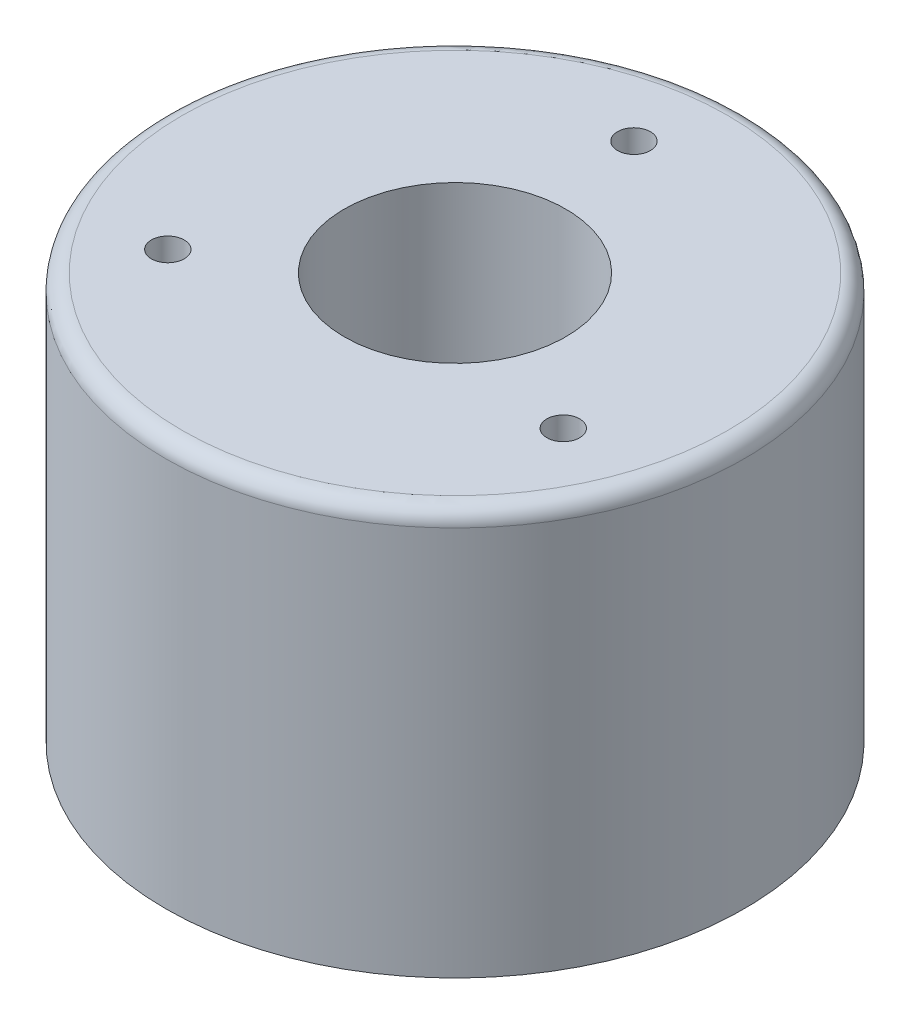
ISO-10303-21;
HEADER;
FILE_DESCRIPTION(('STEP AP214'),'2;1');
FILE_NAME('part.step','',(''),(''),'','','');
FILE_SCHEMA(('AUTOMOTIVE_DESIGN { 1 0 10303 214 1 1 1 1 }'));
ENDSEC;
DATA;
#1=APPLICATION_CONTEXT('core data for automotive mechanical design processes');
#2=APPLICATION_PROTOCOL_DEFINITION('international standard','automotive_design',2000,#1);
#3=PRODUCT_CONTEXT('',#1,'mechanical');
#4=PRODUCT('Part','Part','',(#3));
#5=PRODUCT_RELATED_PRODUCT_CATEGORY('part','',(#4));
#6=PRODUCT_DEFINITION_FORMATION('','',#4);
#7=PRODUCT_DEFINITION_CONTEXT('part definition',#1,'design');
#8=PRODUCT_DEFINITION('design','',#6,#7);
#9=PRODUCT_DEFINITION_SHAPE('','',#8);
#10=(LENGTH_UNIT() NAMED_UNIT(*) SI_UNIT(.MILLI.,.METRE.));
#11=(NAMED_UNIT(*) PLANE_ANGLE_UNIT() SI_UNIT($,.RADIAN.));
#12=(NAMED_UNIT(*) SI_UNIT($,.STERADIAN.) SOLID_ANGLE_UNIT());
#13=UNCERTAINTY_MEASURE_WITH_UNIT(LENGTH_MEASURE(1.E-05),#10,'distance_accuracy_value','');
#14=(GEOMETRIC_REPRESENTATION_CONTEXT(3) GLOBAL_UNCERTAINTY_ASSIGNED_CONTEXT((#13)) GLOBAL_UNIT_ASSIGNED_CONTEXT((#10,
#11,#12)) REPRESENTATION_CONTEXT('',''));
#15=CARTESIAN_POINT('',(0.,0.,0.));
#16=DIRECTION('',(0.,0.,1.));
#17=DIRECTION('',(1.,0.,0.));
#18=AXIS2_PLACEMENT_3D('',#15,#16,#17);
#19=CARTESIAN_POINT('',(0.,50.292,0.));
#20=DIRECTION('',(0.,1.,0.));
#21=DIRECTION('',(0.,0.,1.));
#22=AXIS2_PLACEMENT_3D('',#19,#20,#21);
#23=PLANE('',#22);
#24=CARTESIAN_POINT('',(0.,50.292,0.));
#25=DIRECTION('',(0.,1.,0.));
#26=DIRECTION('',(0.,0.,1.));
#27=AXIS2_PLACEMENT_3D('',#24,#25,#26);
#28=CIRCLE('',#27,33.782);
#29=CARTESIAN_POINT('',(0.,50.292,33.782));
#30=VERTEX_POINT('',#29);
#31=EDGE_CURVE('E40',#30,#30,#28,.T.);
#32=ORIENTED_EDGE('',*,*,#31,.T.);
#33=EDGE_LOOP('',(#32));
#34=FACE_BOUND('',#33,.T.);
#35=CARTESIAN_POINT('',(0.,50.292,0.));
#36=DIRECTION('',(0.,1.,0.));
#37=DIRECTION('',(0.,0.,1.));
#38=AXIS2_PLACEMENT_3D('',#35,#36,#37);
#39=CIRCLE('',#38,13.716);
#40=CARTESIAN_POINT('',(0.,50.292,13.716));
#41=VERTEX_POINT('',#40);
#42=EDGE_CURVE('E69',#41,#41,#39,.T.);
#43=ORIENTED_EDGE('',*,*,#42,.F.);
#44=EDGE_LOOP('',(#43));
#45=FACE_BOUND('',#44,.T.);
#46=CARTESIAN_POINT('',(-3.0577790640726,50.292,-25.2152728955155));
#47=DIRECTION('',(0.,1.,0.));
#48=DIRECTION('',(0.,0.,1.));
#49=AXIS2_PLACEMENT_3D('',#46,#47,#48);
#50=CIRCLE('',#49,2.032);
#51=CARTESIAN_POINT('',(-3.0577790640726,50.292,-23.1832728955155));
#52=VERTEX_POINT('',#51);
#53=EDGE_CURVE('E54',#52,#52,#50,.T.);
#54=ORIENTED_EDGE('',*,*,#53,.F.);
#55=EDGE_LOOP('',(#54));
#56=FACE_BOUND('',#55,.T.);
#57=CARTESIAN_POINT('',(-20.3081773588373,50.292,15.2557507964049));
#58=DIRECTION('',(0.,1.,0.));
#59=DIRECTION('',(0.,0.,1.));
#60=AXIS2_PLACEMENT_3D('',#57,#58,#59);
#61=CIRCLE('',#60,2.032);
#62=CARTESIAN_POINT('',(-20.3081773588373,50.292,17.2877507964049));
#63=VERTEX_POINT('',#62);
#64=EDGE_CURVE('E48',#63,#63,#61,.T.);
#65=ORIENTED_EDGE('',*,*,#64,.F.);
#66=EDGE_LOOP('',(#65));
#67=FACE_BOUND('',#66,.T.);
#68=CARTESIAN_POINT('',(23.3659564229099,50.292,9.95952209911079));
#69=DIRECTION('',(0.,1.,0.));
#70=DIRECTION('',(0.,0.,1.));
#71=AXIS2_PLACEMENT_3D('',#68,#69,#70);
#72=CIRCLE('',#71,2.032);
#73=CARTESIAN_POINT('',(23.3659564229099,50.292,11.9915220991108));
#74=VERTEX_POINT('',#73);
#75=EDGE_CURVE('E60',#74,#74,#72,.T.);
#76=ORIENTED_EDGE('',*,*,#75,.F.);
#77=EDGE_LOOP('',(#76));
#78=FACE_BOUND('',#77,.T.);
#79=ADVANCED_FACE('F33',(#34,#45,#56,#67,#78),#23,.T.);
#80=CARTESIAN_POINT('',(0.,0.,0.));
#81=DIRECTION('',(0.,1.,0.));
#82=DIRECTION('',(0.,0.,1.));
#83=AXIS2_PLACEMENT_3D('',#80,#81,#82);
#84=PLANE('',#83);
#85=CARTESIAN_POINT('',(0.,0.,0.));
#86=DIRECTION('',(0.,1.,0.));
#87=DIRECTION('',(0.,0.,1.));
#88=AXIS2_PLACEMENT_3D('',#85,#86,#87);
#89=CIRCLE('',#88,35.814);
#90=CARTESIAN_POINT('',(0.,0.,35.814));
#91=VERTEX_POINT('',#90);
#92=EDGE_CURVE('E44',#91,#91,#89,.T.);
#93=ORIENTED_EDGE('',*,*,#92,.F.);
#94=EDGE_LOOP('',(#93));
#95=FACE_BOUND('',#94,.T.);
#96=CARTESIAN_POINT('',(-20.3081773588373,0.,15.2557507964049));
#97=DIRECTION('',(0.,1.,0.));
#98=DIRECTION('',(0.,0.,1.));
#99=AXIS2_PLACEMENT_3D('',#96,#97,#98);
#100=CIRCLE('',#99,2.032);
#101=CARTESIAN_POINT('',(-20.3081773588373,0.,17.2877507964049));
#102=VERTEX_POINT('',#101);
#103=EDGE_CURVE('E51',#102,#102,#100,.T.);
#104=ORIENTED_EDGE('',*,*,#103,.T.);
#105=EDGE_LOOP('',(#104));
#106=FACE_BOUND('',#105,.T.);
#107=CARTESIAN_POINT('',(-3.0577790640726,0.,-25.2152728955155));
#108=DIRECTION('',(0.,1.,0.));
#109=DIRECTION('',(0.,0.,1.));
#110=AXIS2_PLACEMENT_3D('',#107,#108,#109);
#111=CIRCLE('',#110,2.032);
#112=CARTESIAN_POINT('',(-3.0577790640726,0.,-23.1832728955155));
#113=VERTEX_POINT('',#112);
#114=EDGE_CURVE('E57',#113,#113,#111,.T.);
#115=ORIENTED_EDGE('',*,*,#114,.T.);
#116=EDGE_LOOP('',(#115));
#117=FACE_BOUND('',#116,.T.);
#118=CARTESIAN_POINT('',(23.3659564229099,0.,9.95952209911079));
#119=DIRECTION('',(0.,1.,0.));
#120=DIRECTION('',(0.,0.,1.));
#121=AXIS2_PLACEMENT_3D('',#118,#119,#120);
#122=CIRCLE('',#121,2.032);
#123=CARTESIAN_POINT('',(23.3659564229099,0.,11.9915220991108));
#124=VERTEX_POINT('',#123);
#125=EDGE_CURVE('E63',#124,#124,#122,.T.);
#126=ORIENTED_EDGE('',*,*,#125,.T.);
#127=EDGE_LOOP('',(#126));
#128=FACE_BOUND('',#127,.T.);
#129=ADVANCED_FACE('F86',(#95,#106,#117,#128),#84,.F.);
#130=CARTESIAN_POINT('',(0.,50.292,0.));
#131=DIRECTION('',(0.,-1.,0.));
#132=DIRECTION('',(0.,0.,-1.));
#133=AXIS2_PLACEMENT_3D('',#130,#131,#132);
#134=CYLINDRICAL_SURFACE('',#133,35.814);
#135=CARTESIAN_POINT('',(0.,48.26,0.));
#136=DIRECTION('',(0.,1.,0.));
#137=DIRECTION('',(0.,0.,1.));
#138=AXIS2_PLACEMENT_3D('',#135,#136,#137);
#139=CIRCLE('',#138,35.814);
#140=CARTESIAN_POINT('',(0.,48.26,35.814));
#141=VERTEX_POINT('',#140);
#142=EDGE_CURVE('E10',#141,#141,#139,.F.);
#143=ORIENTED_EDGE('',*,*,#142,.T.);
#144=EDGE_LOOP('',(#143));
#145=FACE_BOUND('',#144,.T.);
#146=ORIENTED_EDGE('',*,*,#92,.T.);
#147=EDGE_LOOP('',(#146));
#148=FACE_BOUND('',#147,.T.);
#149=ADVANCED_FACE('F101',(#145,#148),#134,.T.);
#150=CARTESIAN_POINT('',(-20.3081773588373,50.292,15.2557507964049));
#151=DIRECTION('',(0.,-1.,0.));
#152=DIRECTION('',(0.,0.,-1.));
#153=AXIS2_PLACEMENT_3D('',#150,#151,#152);
#154=CYLINDRICAL_SURFACE('',#153,2.032);
#155=ORIENTED_EDGE('',*,*,#64,.T.);
#156=EDGE_LOOP('',(#155));
#157=FACE_BOUND('',#156,.T.);
#158=ORIENTED_EDGE('',*,*,#103,.F.);
#159=EDGE_LOOP('',(#158));
#160=FACE_BOUND('',#159,.T.);
#161=ADVANCED_FACE('F107',(#157,#160),#154,.F.);
#162=CARTESIAN_POINT('',(-3.0577790640726,50.292,-25.2152728955155));
#163=DIRECTION('',(0.,-1.,0.));
#164=DIRECTION('',(0.,0.,-1.));
#165=AXIS2_PLACEMENT_3D('',#162,#163,#164);
#166=CYLINDRICAL_SURFACE('',#165,2.032);
#167=ORIENTED_EDGE('',*,*,#53,.T.);
#168=EDGE_LOOP('',(#167));
#169=FACE_BOUND('',#168,.T.);
#170=ORIENTED_EDGE('',*,*,#114,.F.);
#171=EDGE_LOOP('',(#170));
#172=FACE_BOUND('',#171,.T.);
#173=ADVANCED_FACE('F96',(#169,#172),#166,.F.);
#174=CARTESIAN_POINT('',(23.3659564229099,50.292,9.95952209911079));
#175=DIRECTION('',(0.,-1.,0.));
#176=DIRECTION('',(0.,0.,-1.));
#177=AXIS2_PLACEMENT_3D('',#174,#175,#176);
#178=CYLINDRICAL_SURFACE('',#177,2.032);
#179=ORIENTED_EDGE('',*,*,#75,.T.);
#180=EDGE_LOOP('',(#179));
#181=FACE_BOUND('',#180,.T.);
#182=ORIENTED_EDGE('',*,*,#125,.F.);
#183=EDGE_LOOP('',(#182));
#184=FACE_BOUND('',#183,.T.);
#185=ADVANCED_FACE('F80',(#181,#184),#178,.F.);
#186=CARTESIAN_POINT('',(0.,18.542,0.));
#187=DIRECTION('',(0.,1.,0.));
#188=DIRECTION('',(0.,0.,1.));
#189=AXIS2_PLACEMENT_3D('',#186,#187,#188);
#190=CYLINDRICAL_SURFACE('',#189,13.716);
#191=CARTESIAN_POINT('',(0.,18.542,0.));
#192=DIRECTION('',(0.,1.,0.));
#193=DIRECTION('',(0.,0.,1.));
#194=AXIS2_PLACEMENT_3D('',#191,#192,#193);
#195=CIRCLE('',#194,13.716);
#196=CARTESIAN_POINT('',(0.,18.542,13.716));
#197=VERTEX_POINT('',#196);
#198=EDGE_CURVE('E66',#197,#197,#195,.T.);
#199=ORIENTED_EDGE('',*,*,#198,.F.);
#200=EDGE_LOOP('',(#199));
#201=FACE_BOUND('',#200,.T.);
#202=ORIENTED_EDGE('',*,*,#42,.T.);
#203=EDGE_LOOP('',(#202));
#204=FACE_BOUND('',#203,.T.);
#205=ADVANCED_FACE('F77',(#201,#204),#190,.F.);
#206=CARTESIAN_POINT('',(0.,18.542,0.));
#207=DIRECTION('',(0.,1.,0.));
#208=DIRECTION('',(0.,0.,1.));
#209=AXIS2_PLACEMENT_3D('',#206,#207,#208);
#210=PLANE('',#209);
#211=ORIENTED_EDGE('',*,*,#198,.T.);
#212=EDGE_LOOP('',(#211));
#213=FACE_BOUND('',#212,.T.);
#214=ADVANCED_FACE('F75',(#213),#210,.T.);
#215=CARTESIAN_POINT('',(0.,48.26,0.));
#216=DIRECTION('',(0.,1.,0.));
#217=DIRECTION('',(0.,0.,1.));
#218=AXIS2_PLACEMENT_3D('',#215,#216,#217);
#219=TOROIDAL_SURFACE('',#218,33.782,2.032);
#220=ORIENTED_EDGE('',*,*,#142,.F.);
#221=EDGE_LOOP('',(#220));
#222=FACE_BOUND('',#221,.T.);
#223=ORIENTED_EDGE('',*,*,#31,.F.);
#224=EDGE_LOOP('',(#223));
#225=FACE_BOUND('',#224,.T.);
#226=ADVANCED_FACE('F35',(#222,#225),#219,.T.);
#227=CLOSED_SHELL('',(#79,#129,#149,#161,#173,#185,#205,#214,#226));
#228=MANIFOLD_SOLID_BREP('B2',#227);
#229=ADVANCED_BREP_SHAPE_REPRESENTATION('',(#18,#228),#14);
#230=SHAPE_DEFINITION_REPRESENTATION(#9,#229);
ENDSEC;
END-ISO-10303-21;
